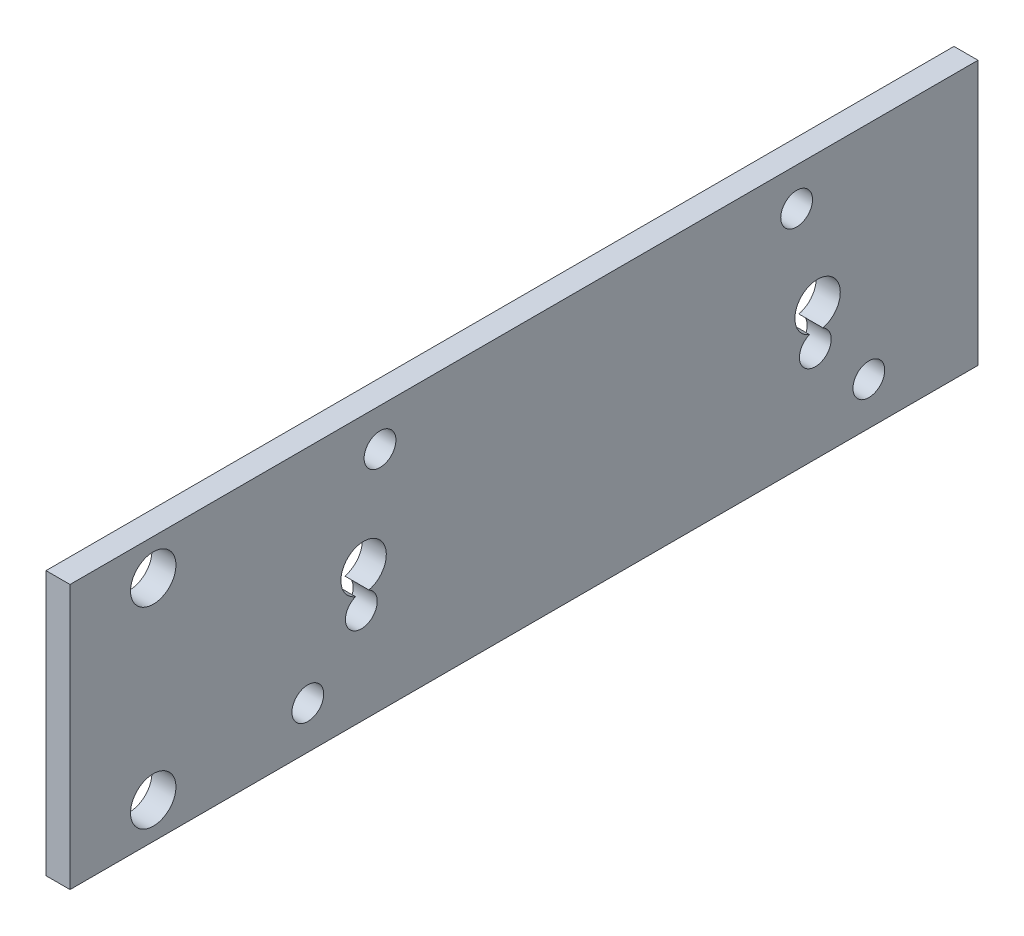
ISO-10303-21;
HEADER;
FILE_DESCRIPTION(('STEP AP214'),'2;1');
FILE_NAME('part.step','',(''),(''),'','','');
FILE_SCHEMA(('AUTOMOTIVE_DESIGN { 1 0 10303 214 1 1 1 1 }'));
ENDSEC;
DATA;
#1=APPLICATION_CONTEXT('core data for automotive mechanical design processes');
#2=APPLICATION_PROTOCOL_DEFINITION('international standard','automotive_design',2000,#1);
#3=PRODUCT_CONTEXT('',#1,'mechanical');
#4=PRODUCT('Part','Part','',(#3));
#5=PRODUCT_RELATED_PRODUCT_CATEGORY('part','',(#4));
#6=PRODUCT_DEFINITION_FORMATION('','',#4);
#7=PRODUCT_DEFINITION_CONTEXT('part definition',#1,'design');
#8=PRODUCT_DEFINITION('design','',#6,#7);
#9=PRODUCT_DEFINITION_SHAPE('','',#8);
#10=(LENGTH_UNIT() NAMED_UNIT(*) SI_UNIT(.MILLI.,.METRE.));
#11=(NAMED_UNIT(*) PLANE_ANGLE_UNIT() SI_UNIT($,.RADIAN.));
#12=(NAMED_UNIT(*) SI_UNIT($,.STERADIAN.) SOLID_ANGLE_UNIT());
#13=UNCERTAINTY_MEASURE_WITH_UNIT(LENGTH_MEASURE(1.E-05),#10,'distance_accuracy_value','');
#14=(GEOMETRIC_REPRESENTATION_CONTEXT(3) GLOBAL_UNCERTAINTY_ASSIGNED_CONTEXT((#13)) GLOBAL_UNIT_ASSIGNED_CONTEXT((#10,
#11,#12)) REPRESENTATION_CONTEXT('',''));
#15=CARTESIAN_POINT('',(0.,0.,0.));
#16=DIRECTION('',(0.,0.,1.));
#17=DIRECTION('',(1.,0.,0.));
#18=AXIS2_PLACEMENT_3D('',#15,#16,#17);
#19=CARTESIAN_POINT('',(34.925,3.17499999999999,5.));
#20=DIRECTION('',(0.,0.,1.));
#21=DIRECTION('',(1.,0.,0.));
#22=AXIS2_PLACEMENT_3D('',#19,#20,#21);
#23=PLANE('',#22);
#24=DIRECTION('',(1.,0.,0.));
#25=VECTOR('',#24,1.);
#26=CARTESIAN_POINT('',(-3.175,0.,5.));
#27=LINE('',#26,#25);
#28=CARTESIAN_POINT('',(-3.175,0.,5.));
#29=VERTEX_POINT('',#28);
#30=CARTESIAN_POINT('',(0.,0.,5.));
#31=VERTEX_POINT('',#30);
#32=EDGE_CURVE('E171',#29,#31,#27,.T.);
#33=ORIENTED_EDGE('',*,*,#32,.F.);
#34=DIRECTION('',(0.,-1.,0.));
#35=VECTOR('',#34,1.);
#36=CARTESIAN_POINT('',(-3.175,3.17499999999999,5.));
#37=LINE('',#36,#35);
#38=CARTESIAN_POINT('',(-3.175,-34.925,5.));
#39=VERTEX_POINT('',#38);
#40=EDGE_CURVE('E207',#29,#39,#37,.T.);
#41=ORIENTED_EDGE('',*,*,#40,.T.);
#42=DIRECTION('',(-1.,0.,0.));
#43=VECTOR('',#42,1.);
#44=CARTESIAN_POINT('',(34.925,-34.925,5.));
#45=LINE('',#44,#43);
#46=CARTESIAN_POINT('',(0.,-34.925,5.));
#47=VERTEX_POINT('',#46);
#48=EDGE_CURVE('E215',#47,#39,#45,.T.);
#49=ORIENTED_EDGE('',*,*,#48,.F.);
#50=DIRECTION('',(0.,1.,0.));
#51=VECTOR('',#50,1.);
#52=CARTESIAN_POINT('',(0.,-34.925,5.));
#53=LINE('',#52,#51);
#54=EDGE_CURVE('E190',#47,#31,#53,.T.);
#55=ORIENTED_EDGE('',*,*,#54,.T.);
#56=EDGE_LOOP('',(#33,#41,#49,#55));
#57=FACE_BOUND('',#56,.T.);
#58=ADVANCED_FACE('F89',(#57),#23,.T.);
#59=CARTESIAN_POINT('',(-3.175,3.17499999999999,-115.));
#60=DIRECTION('',(0.,0.,-1.));
#61=DIRECTION('',(-1.,0.,0.));
#62=AXIS2_PLACEMENT_3D('',#59,#60,#61);
#63=PLANE('',#62);
#64=DIRECTION('',(0.,-1.,0.));
#65=VECTOR('',#64,1.);
#66=CARTESIAN_POINT('',(-3.175,3.17499999999999,-115.));
#67=LINE('',#66,#65);
#68=CARTESIAN_POINT('',(-3.175,0.,-115.));
#69=VERTEX_POINT('',#68);
#70=CARTESIAN_POINT('',(-3.175,-34.925,-115.));
#71=VERTEX_POINT('',#70);
#72=EDGE_CURVE('E187',#69,#71,#67,.T.);
#73=ORIENTED_EDGE('',*,*,#72,.F.);
#74=DIRECTION('',(1.,0.,0.));
#75=VECTOR('',#74,1.);
#76=CARTESIAN_POINT('',(-3.175,0.,-115.));
#77=LINE('',#76,#75);
#78=CARTESIAN_POINT('',(0.,0.,-115.));
#79=VERTEX_POINT('',#78);
#80=EDGE_CURVE('E182',#69,#79,#77,.T.);
#81=ORIENTED_EDGE('',*,*,#80,.T.);
#82=DIRECTION('',(0.,1.,0.));
#83=VECTOR('',#82,1.);
#84=CARTESIAN_POINT('',(0.,-34.925,-115.));
#85=LINE('',#84,#83);
#86=CARTESIAN_POINT('',(0.,-34.925,-115.));
#87=VERTEX_POINT('',#86);
#88=EDGE_CURVE('E197',#87,#79,#85,.T.);
#89=ORIENTED_EDGE('',*,*,#88,.F.);
#90=DIRECTION('',(1.,0.,0.));
#91=VECTOR('',#90,1.);
#92=CARTESIAN_POINT('',(-3.175,-34.925,-115.));
#93=LINE('',#92,#91);
#94=EDGE_CURVE('E203',#71,#87,#93,.T.);
#95=ORIENTED_EDGE('',*,*,#94,.F.);
#96=EDGE_LOOP('',(#73,#81,#89,#95));
#97=FACE_BOUND('',#96,.T.);
#98=ADVANCED_FACE('F275',(#97),#63,.T.);
#99=CARTESIAN_POINT('',(-3.175,3.17499999999999,5.));
#100=DIRECTION('',(-1.,0.,0.));
#101=DIRECTION('',(0.,0.,1.));
#102=AXIS2_PLACEMENT_3D('',#99,#100,#101);
#103=PLANE('',#102);
#104=CARTESIAN_POINT('',(-3.175,-17.4625,-93.8));
#105=DIRECTION('',(-1.,0.,0.));
#106=DIRECTION('',(0.,0.,1.));
#107=AXIS2_PLACEMENT_3D('',#104,#105,#106);
#108=CIRCLE('',#107,3.00000000000001);
#109=CARTESIAN_POINT('',(-3.175,-20.2681818973127,-92.7378563698389));
#110=VERTEX_POINT('',#109);
#111=CARTESIAN_POINT('',(-3.175,-20.3792884602492,-94.5016730564565));
#112=VERTEX_POINT('',#111);
#113=EDGE_CURVE('E155',#110,#112,#108,.T.);
#114=ORIENTED_EDGE('',*,*,#113,.F.);
#115=CARTESIAN_POINT('',(-3.175,-22.225,-93.5));
#116=DIRECTION('',(-1.,0.,0.));
#117=DIRECTION('',(0.,0.,1.));
#118=AXIS2_PLACEMENT_3D('',#115,#116,#117);
#119=CIRCLE('',#118,2.1);
#120=EDGE_CURVE('E164',#112,#110,#119,.T.);
#121=ORIENTED_EDGE('',*,*,#120,.F.);
#122=EDGE_LOOP('',(#114,#121));
#123=FACE_BOUND('',#122,.T.);
#124=CARTESIAN_POINT('',(-3.175,-17.4625,-33.8));
#125=DIRECTION('',(-1.,0.,0.));
#126=DIRECTION('',(0.,0.,1.));
#127=AXIS2_PLACEMENT_3D('',#124,#125,#126);
#128=CIRCLE('',#127,3.00000000000001);
#129=CARTESIAN_POINT('',(-3.175,-20.2681818973127,-32.7378563698389));
#130=VERTEX_POINT('',#129);
#131=CARTESIAN_POINT('',(-3.175,-20.3792884602492,-34.5016730564565));
#132=VERTEX_POINT('',#131);
#133=EDGE_CURVE('E156',#130,#132,#128,.T.);
#134=ORIENTED_EDGE('',*,*,#133,.F.);
#135=CARTESIAN_POINT('',(-3.175,-22.225,-33.5));
#136=DIRECTION('',(-1.,0.,0.));
#137=DIRECTION('',(0.,0.,1.));
#138=AXIS2_PLACEMENT_3D('',#135,#136,#137);
#139=CIRCLE('',#138,2.1);
#140=EDGE_CURVE('E175',#132,#130,#139,.T.);
#141=ORIENTED_EDGE('',*,*,#140,.F.);
#142=EDGE_LOOP('',(#134,#141));
#143=FACE_BOUND('',#142,.T.);
#144=CARTESIAN_POINT('',(-3.175,-4.7625,-6.));
#145=DIRECTION('',(-1.,0.,0.));
#146=DIRECTION('',(0.,0.,1.));
#147=AXIS2_PLACEMENT_3D('',#144,#145,#146);
#148=CIRCLE('',#147,3.);
#149=CARTESIAN_POINT('',(-3.175,-4.7625,-3.));
#150=VERTEX_POINT('',#149);
#151=EDGE_CURVE('E255',#150,#150,#148,.T.);
#152=ORIENTED_EDGE('',*,*,#151,.F.);
#153=EDGE_LOOP('',(#152));
#154=FACE_BOUND('',#153,.T.);
#155=CARTESIAN_POINT('',(-3.175,-30.1625,-6.));
#156=DIRECTION('',(-1.,0.,0.));
#157=DIRECTION('',(0.,0.,1.));
#158=AXIS2_PLACEMENT_3D('',#155,#156,#157);
#159=CIRCLE('',#158,3.);
#160=CARTESIAN_POINT('',(-3.175,-30.1625,-3.));
#161=VERTEX_POINT('',#160);
#162=EDGE_CURVE('E246',#161,#161,#159,.T.);
#163=ORIENTED_EDGE('',*,*,#162,.F.);
#164=EDGE_LOOP('',(#163));
#165=FACE_BOUND('',#164,.T.);
#166=CARTESIAN_POINT('',(-3.175,-29.2960678118655,-100.571067811865));
#167=DIRECTION('',(-1.,0.,0.));
#168=DIRECTION('',(0.,0.,1.));
#169=AXIS2_PLACEMENT_3D('',#166,#167,#168);
#170=CIRCLE('',#169,2.09999999999999);
#171=CARTESIAN_POINT('',(-3.175,-29.2960678118655,-98.471067811865));
#172=VERTEX_POINT('',#171);
#173=EDGE_CURVE('E238',#172,#172,#170,.T.);
#174=ORIENTED_EDGE('',*,*,#173,.F.);
#175=EDGE_LOOP('',(#174));
#176=FACE_BOUND('',#175,.T.);
#177=CARTESIAN_POINT('',(-3.175,-29.2960678118655,-26.4289321881345));
#178=DIRECTION('',(-1.,0.,0.));
#179=DIRECTION('',(0.,0.,1.));
#180=AXIS2_PLACEMENT_3D('',#177,#178,#179);
#181=CIRCLE('',#180,2.09999999999999);
#182=CARTESIAN_POINT('',(-3.175,-29.2960678118655,-24.3289321881345));
#183=VERTEX_POINT('',#182);
#184=EDGE_CURVE('E235',#183,#183,#181,.T.);
#185=ORIENTED_EDGE('',*,*,#184,.F.);
#186=EDGE_LOOP('',(#185));
#187=FACE_BOUND('',#186,.T.);
#188=CARTESIAN_POINT('',(-3.175,-4.99999999999956,-35.97));
#189=DIRECTION('',(-1.,0.,0.));
#190=DIRECTION('',(0.,0.,1.));
#191=AXIS2_PLACEMENT_3D('',#188,#189,#190);
#192=CIRCLE('',#191,2.09999999999999);
#193=CARTESIAN_POINT('',(-3.175,-4.99999999999956,-33.87));
#194=VERTEX_POINT('',#193);
#195=EDGE_CURVE('E228',#194,#194,#192,.T.);
#196=ORIENTED_EDGE('',*,*,#195,.F.);
#197=EDGE_LOOP('',(#196));
#198=FACE_BOUND('',#197,.T.);
#199=CARTESIAN_POINT('',(-3.175,-4.99999999999955,-91.03));
#200=DIRECTION('',(-1.,0.,0.));
#201=DIRECTION('',(0.,0.,1.));
#202=AXIS2_PLACEMENT_3D('',#199,#200,#201);
#203=CIRCLE('',#202,2.09999999999999);
#204=CARTESIAN_POINT('',(-3.175,-4.99999999999955,-88.93));
#205=VERTEX_POINT('',#204);
#206=EDGE_CURVE('E219',#205,#205,#203,.T.);
#207=ORIENTED_EDGE('',*,*,#206,.F.);
#208=EDGE_LOOP('',(#207));
#209=FACE_BOUND('',#208,.T.);
#210=DIRECTION('',(0.,0.,1.));
#211=VECTOR('',#210,1.);
#212=CARTESIAN_POINT('',(-3.175,0.,-115.));
#213=LINE('',#212,#211);
#214=EDGE_CURVE('E181',#69,#29,#213,.T.);
#215=ORIENTED_EDGE('',*,*,#214,.F.);
#216=ORIENTED_EDGE('',*,*,#72,.T.);
#217=DIRECTION('',(0.,0.,-1.));
#218=VECTOR('',#217,1.);
#219=CARTESIAN_POINT('',(-3.175,-34.925,5.));
#220=LINE('',#219,#218);
#221=EDGE_CURVE('E209',#39,#71,#220,.T.);
#222=ORIENTED_EDGE('',*,*,#221,.F.);
#223=ORIENTED_EDGE('',*,*,#40,.F.);
#224=EDGE_LOOP('',(#215,#216,#222,#223));
#225=FACE_BOUND('',#224,.T.);
#226=ADVANCED_FACE('F169',(#123,#143,#154,#165,#176,#187,#198,#209,#225),#103,.T.);
#227=CARTESIAN_POINT('',(0.,-34.925,0.));
#228=DIRECTION('',(0.,-1.,0.));
#229=DIRECTION('',(0.,0.,-1.));
#230=AXIS2_PLACEMENT_3D('',#227,#228,#229);
#231=PLANE('',#230);
#232=DIRECTION('',(0.,0.,-1.));
#233=VECTOR('',#232,1.);
#234=CARTESIAN_POINT('',(0.,-34.925,5.));
#235=LINE('',#234,#233);
#236=EDGE_CURVE('E180',#47,#87,#235,.T.);
#237=ORIENTED_EDGE('',*,*,#236,.F.);
#238=ORIENTED_EDGE('',*,*,#48,.T.);
#239=ORIENTED_EDGE('',*,*,#221,.T.);
#240=ORIENTED_EDGE('',*,*,#94,.T.);
#241=EDGE_LOOP('',(#237,#238,#239,#240));
#242=FACE_BOUND('',#241,.T.);
#243=ADVANCED_FACE('F258',(#242),#231,.T.);
#244=CARTESIAN_POINT('',(0.,-34.925,5.));
#245=DIRECTION('',(-1.,0.,0.));
#246=DIRECTION('',(0.,0.,1.));
#247=AXIS2_PLACEMENT_3D('',#244,#245,#246);
#248=PLANE('',#247);
#249=CARTESIAN_POINT('',(0.,-4.7625,-6.));
#250=DIRECTION('',(-1.,0.,0.));
#251=DIRECTION('',(0.,0.,1.));
#252=AXIS2_PLACEMENT_3D('',#249,#250,#251);
#253=CIRCLE('',#252,3.);
#254=CARTESIAN_POINT('',(0.,-4.7625,-3.));
#255=VERTEX_POINT('',#254);
#256=EDGE_CURVE('E248',#255,#255,#253,.T.);
#257=ORIENTED_EDGE('',*,*,#256,.T.);
#258=EDGE_LOOP('',(#257));
#259=FACE_BOUND('',#258,.T.);
#260=CARTESIAN_POINT('',(0.,-30.1625,-6.));
#261=DIRECTION('',(-1.,0.,0.));
#262=DIRECTION('',(0.,0.,1.));
#263=AXIS2_PLACEMENT_3D('',#260,#261,#262);
#264=CIRCLE('',#263,3.);
#265=CARTESIAN_POINT('',(0.,-30.1625,-3.));
#266=VERTEX_POINT('',#265);
#267=EDGE_CURVE('E243',#266,#266,#264,.T.);
#268=ORIENTED_EDGE('',*,*,#267,.T.);
#269=EDGE_LOOP('',(#268));
#270=FACE_BOUND('',#269,.T.);
#271=CARTESIAN_POINT('',(0.,-29.2960678118655,-100.571067811865));
#272=DIRECTION('',(-1.,0.,0.));
#273=DIRECTION('',(0.,0.,1.));
#274=AXIS2_PLACEMENT_3D('',#271,#272,#273);
#275=CIRCLE('',#274,2.09999999999999);
#276=CARTESIAN_POINT('',(0.,-29.2960678118655,-98.471067811865));
#277=VERTEX_POINT('',#276);
#278=EDGE_CURVE('E218',#277,#277,#275,.T.);
#279=ORIENTED_EDGE('',*,*,#278,.T.);
#280=EDGE_LOOP('',(#279));
#281=FACE_BOUND('',#280,.T.);
#282=CARTESIAN_POINT('',(0.,-29.2960678118655,-26.4289321881345));
#283=DIRECTION('',(-1.,0.,0.));
#284=DIRECTION('',(0.,0.,1.));
#285=AXIS2_PLACEMENT_3D('',#282,#283,#284);
#286=CIRCLE('',#285,2.09999999999999);
#287=CARTESIAN_POINT('',(0.,-29.2960678118655,-24.3289321881345));
#288=VERTEX_POINT('',#287);
#289=EDGE_CURVE('E232',#288,#288,#286,.T.);
#290=ORIENTED_EDGE('',*,*,#289,.T.);
#291=EDGE_LOOP('',(#290));
#292=FACE_BOUND('',#291,.T.);
#293=CARTESIAN_POINT('',(0.,-4.99999999999956,-35.97));
#294=DIRECTION('',(-1.,0.,0.));
#295=DIRECTION('',(0.,0.,1.));
#296=AXIS2_PLACEMENT_3D('',#293,#294,#295);
#297=CIRCLE('',#296,2.09999999999999);
#298=CARTESIAN_POINT('',(0.,-4.99999999999956,-33.87));
#299=VERTEX_POINT('',#298);
#300=EDGE_CURVE('E230',#299,#299,#297,.T.);
#301=ORIENTED_EDGE('',*,*,#300,.T.);
#302=EDGE_LOOP('',(#301));
#303=FACE_BOUND('',#302,.T.);
#304=CARTESIAN_POINT('',(0.,-4.99999999999955,-91.03));
#305=DIRECTION('',(-1.,0.,0.));
#306=DIRECTION('',(0.,0.,1.));
#307=AXIS2_PLACEMENT_3D('',#304,#305,#306);
#308=CIRCLE('',#307,2.09999999999999);
#309=CARTESIAN_POINT('',(0.,-4.99999999999955,-88.93));
#310=VERTEX_POINT('',#309);
#311=EDGE_CURVE('E223',#310,#310,#308,.T.);
#312=ORIENTED_EDGE('',*,*,#311,.T.);
#313=EDGE_LOOP('',(#312));
#314=FACE_BOUND('',#313,.T.);
#315=CARTESIAN_POINT('',(0.,-22.225,-93.5));
#316=DIRECTION('',(-1.,0.,0.));
#317=DIRECTION('',(0.,0.,1.));
#318=AXIS2_PLACEMENT_3D('',#315,#316,#317);
#319=CIRCLE('',#318,2.1);
#320=CARTESIAN_POINT('',(0.,-20.3792884602492,-94.5016730564565));
#321=VERTEX_POINT('',#320);
#322=CARTESIAN_POINT('',(0.,-20.2681818973127,-92.7378563698389));
#323=VERTEX_POINT('',#322);
#324=EDGE_CURVE('E170',#321,#323,#319,.T.);
#325=ORIENTED_EDGE('',*,*,#324,.T.);
#326=CARTESIAN_POINT('',(0.,-17.4625,-93.8));
#327=DIRECTION('',(-1.,0.,0.));
#328=DIRECTION('',(0.,0.,1.));
#329=AXIS2_PLACEMENT_3D('',#326,#327,#328);
#330=CIRCLE('',#329,3.00000000000001);
#331=EDGE_CURVE('E115',#323,#321,#330,.T.);
#332=ORIENTED_EDGE('',*,*,#331,.T.);
#333=EDGE_LOOP('',(#325,#332));
#334=FACE_BOUND('',#333,.T.);
#335=CARTESIAN_POINT('',(0.,-22.225,-33.5));
#336=DIRECTION('',(-1.,0.,0.));
#337=DIRECTION('',(0.,0.,1.));
#338=AXIS2_PLACEMENT_3D('',#335,#336,#337);
#339=CIRCLE('',#338,2.1);
#340=CARTESIAN_POINT('',(0.,-20.3792884602492,-34.5016730564565));
#341=VERTEX_POINT('',#340);
#342=CARTESIAN_POINT('',(0.,-20.2681818973127,-32.7378563698389));
#343=VERTEX_POINT('',#342);
#344=EDGE_CURVE('E192',#341,#343,#339,.T.);
#345=ORIENTED_EDGE('',*,*,#344,.T.);
#346=CARTESIAN_POINT('',(0.,-17.4625,-33.8));
#347=DIRECTION('',(-1.,0.,0.));
#348=DIRECTION('',(0.,0.,1.));
#349=AXIS2_PLACEMENT_3D('',#346,#347,#348);
#350=CIRCLE('',#349,3.00000000000001);
#351=EDGE_CURVE('E104',#343,#341,#350,.T.);
#352=ORIENTED_EDGE('',*,*,#351,.T.);
#353=EDGE_LOOP('',(#345,#352));
#354=FACE_BOUND('',#353,.T.);
#355=ORIENTED_EDGE('',*,*,#88,.T.);
#356=DIRECTION('',(0.,0.,-1.));
#357=VECTOR('',#356,1.);
#358=CARTESIAN_POINT('',(0.,0.,5.));
#359=LINE('',#358,#357);
#360=EDGE_CURVE('E172',#31,#79,#359,.T.);
#361=ORIENTED_EDGE('',*,*,#360,.F.);
#362=ORIENTED_EDGE('',*,*,#54,.F.);
#363=ORIENTED_EDGE('',*,*,#236,.T.);
#364=EDGE_LOOP('',(#355,#361,#362,#363));
#365=FACE_BOUND('',#364,.T.);
#366=ADVANCED_FACE('F200',(#259,#270,#281,#292,#303,#314,#334,#354,#365),#248,.F.);
#367=CARTESIAN_POINT('',(-3.175,-22.225,-33.5));
#368=DIRECTION('',(-1.,0.,0.));
#369=DIRECTION('',(0.,0.,1.));
#370=AXIS2_PLACEMENT_3D('',#367,#368,#369);
#371=CYLINDRICAL_SURFACE('',#370,2.1);
#372=ORIENTED_EDGE('',*,*,#344,.F.);
#373=DIRECTION('',(-1.,0.,0.));
#374=VECTOR('',#373,1.);
#375=CARTESIAN_POINT('',(-1.5875,-20.3792884602492,-34.5016730564565));
#376=LINE('',#375,#374);
#377=EDGE_CURVE('E12',#341,#132,#376,.T.);
#378=ORIENTED_EDGE('',*,*,#377,.T.);
#379=ORIENTED_EDGE('',*,*,#140,.T.);
#380=DIRECTION('',(-1.,0.,0.));
#381=VECTOR('',#380,1.);
#382=CARTESIAN_POINT('',(-1.5875,-20.2681818973127,-32.7378563698389));
#383=LINE('',#382,#381);
#384=EDGE_CURVE('E97',#130,#343,#383,.F.);
#385=ORIENTED_EDGE('',*,*,#384,.T.);
#386=EDGE_LOOP('',(#372,#378,#379,#385));
#387=FACE_BOUND('',#386,.T.);
#388=ADVANCED_FACE('F195',(#387),#371,.F.);
#389=CARTESIAN_POINT('',(-3.175,-22.225,-93.5));
#390=DIRECTION('',(-1.,0.,0.));
#391=DIRECTION('',(0.,0.,1.));
#392=AXIS2_PLACEMENT_3D('',#389,#390,#391);
#393=CYLINDRICAL_SURFACE('',#392,2.1);
#394=ORIENTED_EDGE('',*,*,#324,.F.);
#395=DIRECTION('',(-1.,0.,0.));
#396=VECTOR('',#395,1.);
#397=CARTESIAN_POINT('',(-1.5875,-20.3792884602492,-94.5016730564565));
#398=LINE('',#397,#396);
#399=EDGE_CURVE('E154',#321,#112,#398,.T.);
#400=ORIENTED_EDGE('',*,*,#399,.T.);
#401=ORIENTED_EDGE('',*,*,#120,.T.);
#402=DIRECTION('',(-1.,0.,0.));
#403=VECTOR('',#402,1.);
#404=CARTESIAN_POINT('',(-1.5875,-20.2681818973127,-92.7378563698389));
#405=LINE('',#404,#403);
#406=EDGE_CURVE('E157',#110,#323,#405,.F.);
#407=ORIENTED_EDGE('',*,*,#406,.T.);
#408=EDGE_LOOP('',(#394,#400,#401,#407));
#409=FACE_BOUND('',#408,.T.);
#410=ADVANCED_FACE('F165',(#409),#393,.F.);
#411=CARTESIAN_POINT('',(-3.175,0.,-115.));
#412=DIRECTION('',(0.,-1.,0.));
#413=DIRECTION('',(0.,0.,-1.));
#414=AXIS2_PLACEMENT_3D('',#411,#412,#413);
#415=PLANE('',#414);
#416=ORIENTED_EDGE('',*,*,#32,.T.);
#417=ORIENTED_EDGE('',*,*,#360,.T.);
#418=ORIENTED_EDGE('',*,*,#80,.F.);
#419=ORIENTED_EDGE('',*,*,#214,.T.);
#420=EDGE_LOOP('',(#416,#417,#418,#419));
#421=FACE_BOUND('',#420,.T.);
#422=ADVANCED_FACE('F286',(#421),#415,.F.);
#423=CARTESIAN_POINT('',(0.,-4.99999999999955,-91.03));
#424=DIRECTION('',(-1.,0.,0.));
#425=DIRECTION('',(0.,0.,1.));
#426=AXIS2_PLACEMENT_3D('',#423,#424,#425);
#427=CYLINDRICAL_SURFACE('',#426,2.09999999999999);
#428=ORIENTED_EDGE('',*,*,#311,.F.);
#429=EDGE_LOOP('',(#428));
#430=FACE_BOUND('',#429,.T.);
#431=ORIENTED_EDGE('',*,*,#206,.T.);
#432=EDGE_LOOP('',(#431));
#433=FACE_BOUND('',#432,.T.);
#434=ADVANCED_FACE('F292',(#430,#433),#427,.F.);
#435=CARTESIAN_POINT('',(0.,-4.99999999999956,-35.97));
#436=DIRECTION('',(-1.,0.,0.));
#437=DIRECTION('',(0.,0.,1.));
#438=AXIS2_PLACEMENT_3D('',#435,#436,#437);
#439=CYLINDRICAL_SURFACE('',#438,2.09999999999999);
#440=ORIENTED_EDGE('',*,*,#300,.F.);
#441=EDGE_LOOP('',(#440));
#442=FACE_BOUND('',#441,.T.);
#443=ORIENTED_EDGE('',*,*,#195,.T.);
#444=EDGE_LOOP('',(#443));
#445=FACE_BOUND('',#444,.T.);
#446=ADVANCED_FACE('F300',(#442,#445),#439,.F.);
#447=CARTESIAN_POINT('',(0.,-29.2960678118655,-26.4289321881345));
#448=DIRECTION('',(-1.,0.,0.));
#449=DIRECTION('',(0.,0.,1.));
#450=AXIS2_PLACEMENT_3D('',#447,#448,#449);
#451=CYLINDRICAL_SURFACE('',#450,2.09999999999999);
#452=ORIENTED_EDGE('',*,*,#289,.F.);
#453=EDGE_LOOP('',(#452));
#454=FACE_BOUND('',#453,.T.);
#455=ORIENTED_EDGE('',*,*,#184,.T.);
#456=EDGE_LOOP('',(#455));
#457=FACE_BOUND('',#456,.T.);
#458=ADVANCED_FACE('F355',(#454,#457),#451,.F.);
#459=CARTESIAN_POINT('',(0.,-29.2960678118655,-100.571067811865));
#460=DIRECTION('',(-1.,0.,0.));
#461=DIRECTION('',(0.,0.,1.));
#462=AXIS2_PLACEMENT_3D('',#459,#460,#461);
#463=CYLINDRICAL_SURFACE('',#462,2.09999999999999);
#464=ORIENTED_EDGE('',*,*,#278,.F.);
#465=EDGE_LOOP('',(#464));
#466=FACE_BOUND('',#465,.T.);
#467=ORIENTED_EDGE('',*,*,#173,.T.);
#468=EDGE_LOOP('',(#467));
#469=FACE_BOUND('',#468,.T.);
#470=ADVANCED_FACE('F313',(#466,#469),#463,.F.);
#471=CARTESIAN_POINT('',(0.,-17.4625,-93.8));
#472=DIRECTION('',(-1.,0.,0.));
#473=DIRECTION('',(0.,0.,1.));
#474=AXIS2_PLACEMENT_3D('',#471,#472,#473);
#475=CYLINDRICAL_SURFACE('',#474,3.00000000000001);
#476=ORIENTED_EDGE('',*,*,#331,.F.);
#477=ORIENTED_EDGE('',*,*,#406,.F.);
#478=ORIENTED_EDGE('',*,*,#113,.T.);
#479=ORIENTED_EDGE('',*,*,#399,.F.);
#480=EDGE_LOOP('',(#476,#477,#478,#479));
#481=FACE_BOUND('',#480,.T.);
#482=ADVANCED_FACE('F152',(#481),#475,.F.);
#483=CARTESIAN_POINT('',(0.,-17.4625,-33.8));
#484=DIRECTION('',(-1.,0.,0.));
#485=DIRECTION('',(0.,0.,1.));
#486=AXIS2_PLACEMENT_3D('',#483,#484,#485);
#487=CYLINDRICAL_SURFACE('',#486,3.00000000000001);
#488=ORIENTED_EDGE('',*,*,#351,.F.);
#489=ORIENTED_EDGE('',*,*,#384,.F.);
#490=ORIENTED_EDGE('',*,*,#133,.T.);
#491=ORIENTED_EDGE('',*,*,#377,.F.);
#492=EDGE_LOOP('',(#488,#489,#490,#491));
#493=FACE_BOUND('',#492,.T.);
#494=ADVANCED_FACE('F312',(#493),#487,.F.);
#495=CARTESIAN_POINT('',(0.,-30.1625,-6.));
#496=DIRECTION('',(-1.,0.,0.));
#497=DIRECTION('',(0.,0.,1.));
#498=AXIS2_PLACEMENT_3D('',#495,#496,#497);
#499=CYLINDRICAL_SURFACE('',#498,3.);
#500=ORIENTED_EDGE('',*,*,#267,.F.);
#501=EDGE_LOOP('',(#500));
#502=FACE_BOUND('',#501,.T.);
#503=ORIENTED_EDGE('',*,*,#162,.T.);
#504=EDGE_LOOP('',(#503));
#505=FACE_BOUND('',#504,.T.);
#506=ADVANCED_FACE('F325',(#502,#505),#499,.F.);
#507=CARTESIAN_POINT('',(0.,-4.7625,-6.));
#508=DIRECTION('',(-1.,0.,0.));
#509=DIRECTION('',(0.,0.,1.));
#510=AXIS2_PLACEMENT_3D('',#507,#508,#509);
#511=CYLINDRICAL_SURFACE('',#510,3.);
#512=ORIENTED_EDGE('',*,*,#256,.F.);
#513=EDGE_LOOP('',(#512));
#514=FACE_BOUND('',#513,.T.);
#515=ORIENTED_EDGE('',*,*,#151,.T.);
#516=EDGE_LOOP('',(#515));
#517=FACE_BOUND('',#516,.T.);
#518=ADVANCED_FACE('F329',(#514,#517),#511,.F.);
#519=CLOSED_SHELL('',(#58,#98,#226,#243,#366,#388,#410,#422,#434,#446,#458,#470,#482,#494,#506,#518));
#520=MANIFOLD_SOLID_BREP('B2',#519);
#521=ADVANCED_BREP_SHAPE_REPRESENTATION('',(#18,#520),#14);
#522=SHAPE_DEFINITION_REPRESENTATION(#9,#521);
ENDSEC;
END-ISO-10303-21;
